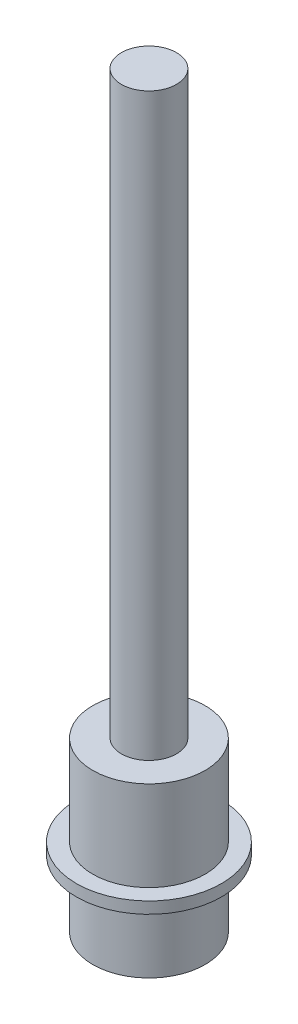
ISO-10303-21;
HEADER;
FILE_DESCRIPTION(('STEP AP214'),'2;1');
FILE_NAME('part.step','',(''),(''),'','','');
FILE_SCHEMA(('AUTOMOTIVE_DESIGN { 1 0 10303 214 1 1 1 1 }'));
ENDSEC;
DATA;
#1=APPLICATION_CONTEXT('core data for automotive mechanical design processes');
#2=APPLICATION_PROTOCOL_DEFINITION('international standard','automotive_design',2000,#1);
#3=PRODUCT_CONTEXT('',#1,'mechanical');
#4=PRODUCT('Part','Part','',(#3));
#5=PRODUCT_RELATED_PRODUCT_CATEGORY('part','',(#4));
#6=PRODUCT_DEFINITION_FORMATION('','',#4);
#7=PRODUCT_DEFINITION_CONTEXT('part definition',#1,'design');
#8=PRODUCT_DEFINITION('design','',#6,#7);
#9=PRODUCT_DEFINITION_SHAPE('','',#8);
#10=(LENGTH_UNIT() NAMED_UNIT(*) SI_UNIT(.MILLI.,.METRE.));
#11=(NAMED_UNIT(*) PLANE_ANGLE_UNIT() SI_UNIT($,.RADIAN.));
#12=(NAMED_UNIT(*) SI_UNIT($,.STERADIAN.) SOLID_ANGLE_UNIT());
#13=UNCERTAINTY_MEASURE_WITH_UNIT(LENGTH_MEASURE(1.E-05),#10,'distance_accuracy_value','');
#14=(GEOMETRIC_REPRESENTATION_CONTEXT(3) GLOBAL_UNCERTAINTY_ASSIGNED_CONTEXT((#13)) GLOBAL_UNIT_ASSIGNED_CONTEXT((#10,
#11,#12)) REPRESENTATION_CONTEXT('',''));
#15=CARTESIAN_POINT('',(0.,0.,0.));
#16=DIRECTION('',(0.,0.,1.));
#17=DIRECTION('',(1.,0.,0.));
#18=AXIS2_PLACEMENT_3D('',#15,#16,#17);
#19=CARTESIAN_POINT('',(0.,14.5,0.));
#20=DIRECTION('',(0.,1.,0.));
#21=DIRECTION('',(0.,0.,1.));
#22=AXIS2_PLACEMENT_3D('',#19,#20,#21);
#23=PLANE('',#22);
#24=CARTESIAN_POINT('',(0.,14.5,0.));
#25=DIRECTION('',(0.,1.,0.));
#26=DIRECTION('',(0.,0.,1.));
#27=AXIS2_PLACEMENT_3D('',#24,#25,#26);
#28=CIRCLE('',#27,4.845);
#29=CARTESIAN_POINT('',(0.,14.5,4.845));
#30=VERTEX_POINT('',#29);
#31=EDGE_CURVE('E60',#30,#30,#28,.T.);
#32=ORIENTED_EDGE('',*,*,#31,.T.);
#33=EDGE_LOOP('',(#32));
#34=FACE_BOUND('',#33,.T.);
#35=CARTESIAN_POINT('',(0.,14.5,0.));
#36=DIRECTION('',(0.,1.,0.));
#37=DIRECTION('',(0.,0.,1.));
#38=AXIS2_PLACEMENT_3D('',#35,#36,#37);
#39=CIRCLE('',#38,2.375);
#40=CARTESIAN_POINT('',(0.,14.5,2.375));
#41=VERTEX_POINT('',#40);
#42=EDGE_CURVE('E64',#41,#41,#39,.T.);
#43=ORIENTED_EDGE('',*,*,#42,.F.);
#44=EDGE_LOOP('',(#43));
#45=FACE_BOUND('',#44,.T.);
#46=ADVANCED_FACE('F33',(#34,#45),#23,.T.);
#47=CARTESIAN_POINT('',(0.,6.75,0.));
#48=DIRECTION('',(0.,1.,0.));
#49=DIRECTION('',(0.,0.,1.));
#50=AXIS2_PLACEMENT_3D('',#47,#48,#49);
#51=PLANE('',#50);
#52=CARTESIAN_POINT('',(0.,6.75,0.));
#53=DIRECTION('',(0.,1.,0.));
#54=DIRECTION('',(0.,0.,1.));
#55=AXIS2_PLACEMENT_3D('',#52,#53,#54);
#56=CIRCLE('',#55,6.25);
#57=CARTESIAN_POINT('',(0.,6.75,6.25));
#58=VERTEX_POINT('',#57);
#59=EDGE_CURVE('E48',#58,#58,#56,.T.);
#60=ORIENTED_EDGE('',*,*,#59,.T.);
#61=EDGE_LOOP('',(#60));
#62=FACE_BOUND('',#61,.T.);
#63=CARTESIAN_POINT('',(0.,6.75,0.));
#64=DIRECTION('',(0.,1.,0.));
#65=DIRECTION('',(0.,0.,1.));
#66=AXIS2_PLACEMENT_3D('',#63,#64,#65);
#67=CIRCLE('',#66,4.845);
#68=CARTESIAN_POINT('',(0.,6.75,4.845));
#69=VERTEX_POINT('',#68);
#70=EDGE_CURVE('E52',#69,#69,#67,.T.);
#71=ORIENTED_EDGE('',*,*,#70,.F.);
#72=EDGE_LOOP('',(#71));
#73=FACE_BOUND('',#72,.T.);
#74=ADVANCED_FACE('F80',(#62,#73),#51,.T.);
#75=CARTESIAN_POINT('',(0.,0.,0.));
#76=DIRECTION('',(0.,1.,0.));
#77=DIRECTION('',(0.,0.,1.));
#78=AXIS2_PLACEMENT_3D('',#75,#76,#77);
#79=PLANE('',#78);
#80=CARTESIAN_POINT('',(0.,0.,0.));
#81=DIRECTION('',(0.,1.,0.));
#82=DIRECTION('',(0.,0.,1.));
#83=AXIS2_PLACEMENT_3D('',#80,#81,#82);
#84=CIRCLE('',#83,4.845);
#85=CARTESIAN_POINT('',(0.,0.,4.845));
#86=VERTEX_POINT('',#85);
#87=EDGE_CURVE('E37',#86,#86,#84,.T.);
#88=ORIENTED_EDGE('',*,*,#87,.F.);
#89=EDGE_LOOP('',(#88));
#90=FACE_BOUND('',#89,.T.);
#91=CARTESIAN_POINT('',(0.,0.,0.));
#92=DIRECTION('',(0.,1.,0.));
#93=DIRECTION('',(0.,0.,1.));
#94=AXIS2_PLACEMENT_3D('',#91,#92,#93);
#95=CIRCLE('',#94,2.375);
#96=CARTESIAN_POINT('',(0.,0.,2.375));
#97=VERTEX_POINT('',#96);
#98=EDGE_CURVE('E44',#97,#97,#95,.T.);
#99=ORIENTED_EDGE('',*,*,#98,.T.);
#100=EDGE_LOOP('',(#99));
#101=FACE_BOUND('',#100,.T.);
#102=ADVANCED_FACE('F86',(#90,#101),#79,.F.);
#103=CARTESIAN_POINT('',(0.,5.75,0.));
#104=DIRECTION('',(0.,-1.,0.));
#105=DIRECTION('',(0.,0.,-1.));
#106=AXIS2_PLACEMENT_3D('',#103,#104,#105);
#107=CYLINDRICAL_SURFACE('',#106,4.845);
#108=CARTESIAN_POINT('',(0.,5.75,0.));
#109=DIRECTION('',(0.,1.,0.));
#110=DIRECTION('',(0.,0.,1.));
#111=AXIS2_PLACEMENT_3D('',#108,#109,#110);
#112=CIRCLE('',#111,4.845);
#113=CARTESIAN_POINT('',(0.,5.75,4.845));
#114=VERTEX_POINT('',#113);
#115=EDGE_CURVE('E10',#114,#114,#112,.T.);
#116=ORIENTED_EDGE('',*,*,#115,.F.);
#117=EDGE_LOOP('',(#116));
#118=FACE_BOUND('',#117,.T.);
#119=ORIENTED_EDGE('',*,*,#87,.T.);
#120=EDGE_LOOP('',(#119));
#121=FACE_BOUND('',#120,.T.);
#122=ADVANCED_FACE('F35',(#118,#121),#107,.T.);
#123=CARTESIAN_POINT('',(0.,5.75,0.));
#124=DIRECTION('',(0.,-1.,0.));
#125=DIRECTION('',(0.,0.,-1.));
#126=AXIS2_PLACEMENT_3D('',#123,#124,#125);
#127=CYLINDRICAL_SURFACE('',#126,2.375);
#128=ORIENTED_EDGE('',*,*,#98,.F.);
#129=EDGE_LOOP('',(#128));
#130=FACE_BOUND('',#129,.T.);
#131=CARTESIAN_POINT('',(0.,12.5,0.));
#132=DIRECTION('',(0.,1.,0.));
#133=DIRECTION('',(0.,0.,1.));
#134=AXIS2_PLACEMENT_3D('',#131,#132,#133);
#135=CIRCLE('',#134,2.375);
#136=CARTESIAN_POINT('',(0.,12.5,2.375));
#137=VERTEX_POINT('',#136);
#138=EDGE_CURVE('E57',#137,#137,#135,.T.);
#139=ORIENTED_EDGE('',*,*,#138,.T.);
#140=EDGE_LOOP('',(#139));
#141=FACE_BOUND('',#140,.T.);
#142=ADVANCED_FACE('F102',(#130,#141),#127,.F.);
#143=CARTESIAN_POINT('',(0.,5.75,0.));
#144=DIRECTION('',(0.,1.,0.));
#145=DIRECTION('',(0.,0.,1.));
#146=AXIS2_PLACEMENT_3D('',#143,#144,#145);
#147=PLANE('',#146);
#148=CARTESIAN_POINT('',(0.,5.75,0.));
#149=DIRECTION('',(0.,1.,0.));
#150=DIRECTION('',(0.,0.,1.));
#151=AXIS2_PLACEMENT_3D('',#148,#149,#150);
#152=CIRCLE('',#151,6.25);
#153=CARTESIAN_POINT('',(0.,5.75,6.25));
#154=VERTEX_POINT('',#153);
#155=EDGE_CURVE('E49',#154,#154,#152,.T.);
#156=ORIENTED_EDGE('',*,*,#155,.F.);
#157=EDGE_LOOP('',(#156));
#158=FACE_BOUND('',#157,.T.);
#159=ORIENTED_EDGE('',*,*,#115,.T.);
#160=EDGE_LOOP('',(#159));
#161=FACE_BOUND('',#160,.T.);
#162=ADVANCED_FACE('F99',(#158,#161),#147,.F.);
#163=CARTESIAN_POINT('',(0.,6.75,0.));
#164=DIRECTION('',(0.,-1.,0.));
#165=DIRECTION('',(0.,0.,-1.));
#166=AXIS2_PLACEMENT_3D('',#163,#164,#165);
#167=CYLINDRICAL_SURFACE('',#166,6.25);
#168=ORIENTED_EDGE('',*,*,#59,.F.);
#169=EDGE_LOOP('',(#168));
#170=FACE_BOUND('',#169,.T.);
#171=ORIENTED_EDGE('',*,*,#155,.T.);
#172=EDGE_LOOP('',(#171));
#173=FACE_BOUND('',#172,.T.);
#174=ADVANCED_FACE('F96',(#170,#173),#167,.T.);
#175=CARTESIAN_POINT('',(0.,12.5,0.));
#176=DIRECTION('',(0.,-1.,0.));
#177=DIRECTION('',(0.,0.,-1.));
#178=AXIS2_PLACEMENT_3D('',#175,#176,#177);
#179=CYLINDRICAL_SURFACE('',#178,4.845);
#180=ORIENTED_EDGE('',*,*,#70,.T.);
#181=EDGE_LOOP('',(#180));
#182=FACE_BOUND('',#181,.T.);
#183=ORIENTED_EDGE('',*,*,#31,.F.);
#184=EDGE_LOOP('',(#183));
#185=FACE_BOUND('',#184,.T.);
#186=ADVANCED_FACE('F93',(#182,#185),#179,.T.);
#187=CARTESIAN_POINT('',(0.,12.5,0.));
#188=DIRECTION('',(0.,1.,0.));
#189=DIRECTION('',(0.,0.,1.));
#190=AXIS2_PLACEMENT_3D('',#187,#188,#189);
#191=PLANE('',#190);
#192=ORIENTED_EDGE('',*,*,#138,.F.);
#193=EDGE_LOOP('',(#192));
#194=FACE_BOUND('',#193,.T.);
#195=ADVANCED_FACE('F75',(#194),#191,.F.);
#196=CARTESIAN_POINT('',(0.,64.5,0.));
#197=DIRECTION('',(0.,-1.,0.));
#198=DIRECTION('',(0.,0.,-1.));
#199=AXIS2_PLACEMENT_3D('',#196,#197,#198);
#200=CYLINDRICAL_SURFACE('',#199,2.375);
#201=CARTESIAN_POINT('',(0.,64.5,0.));
#202=DIRECTION('',(0.,1.,0.));
#203=DIRECTION('',(0.,0.,1.));
#204=AXIS2_PLACEMENT_3D('',#201,#202,#203);
#205=CIRCLE('',#204,2.375);
#206=CARTESIAN_POINT('',(0.,64.5,2.375));
#207=VERTEX_POINT('',#206);
#208=EDGE_CURVE('E63',#207,#207,#205,.T.);
#209=ORIENTED_EDGE('',*,*,#208,.F.);
#210=EDGE_LOOP('',(#209));
#211=FACE_BOUND('',#210,.T.);
#212=ORIENTED_EDGE('',*,*,#42,.T.);
#213=EDGE_LOOP('',(#212));
#214=FACE_BOUND('',#213,.T.);
#215=ADVANCED_FACE('F72',(#211,#214),#200,.T.);
#216=CARTESIAN_POINT('',(0.,64.5,0.));
#217=DIRECTION('',(0.,1.,0.));
#218=DIRECTION('',(0.,0.,1.));
#219=AXIS2_PLACEMENT_3D('',#216,#217,#218);
#220=PLANE('',#219);
#221=ORIENTED_EDGE('',*,*,#208,.T.);
#222=EDGE_LOOP('',(#221));
#223=FACE_BOUND('',#222,.T.);
#224=ADVANCED_FACE('F70',(#223),#220,.T.);
#225=CLOSED_SHELL('',(#46,#74,#102,#122,#142,#162,#174,#186,#195,#215,#224));
#226=MANIFOLD_SOLID_BREP('B2',#225);
#227=ADVANCED_BREP_SHAPE_REPRESENTATION('',(#18,#226),#14);
#228=SHAPE_DEFINITION_REPRESENTATION(#9,#227);
ENDSEC;
END-ISO-10303-21;
